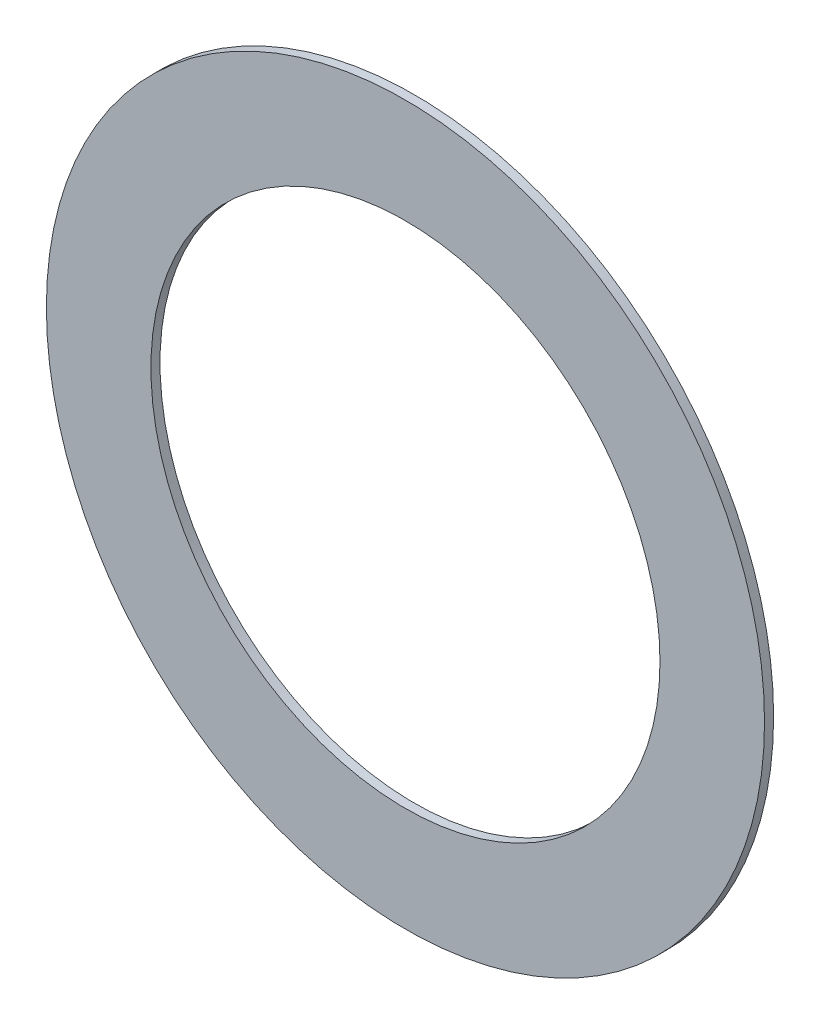
ISO-10303-21;
HEADER;
FILE_DESCRIPTION(('STEP AP214'),'2;1');
FILE_NAME('part.step','',(''),(''),'','','');
FILE_SCHEMA(('AUTOMOTIVE_DESIGN { 1 0 10303 214 1 1 1 1 }'));
ENDSEC;
DATA;
#1=APPLICATION_CONTEXT('core data for automotive mechanical design processes');
#2=APPLICATION_PROTOCOL_DEFINITION('international standard','automotive_design',2000,#1);
#3=PRODUCT_CONTEXT('',#1,'mechanical');
#4=PRODUCT('Part','Part','',(#3));
#5=PRODUCT_RELATED_PRODUCT_CATEGORY('part','',(#4));
#6=PRODUCT_DEFINITION_FORMATION('','',#4);
#7=PRODUCT_DEFINITION_CONTEXT('part definition',#1,'design');
#8=PRODUCT_DEFINITION('design','',#6,#7);
#9=PRODUCT_DEFINITION_SHAPE('','',#8);
#10=(LENGTH_UNIT() NAMED_UNIT(*) SI_UNIT(.MILLI.,.METRE.));
#11=(NAMED_UNIT(*) PLANE_ANGLE_UNIT() SI_UNIT($,.RADIAN.));
#12=(NAMED_UNIT(*) SI_UNIT($,.STERADIAN.) SOLID_ANGLE_UNIT());
#13=UNCERTAINTY_MEASURE_WITH_UNIT(LENGTH_MEASURE(1.E-05),#10,'distance_accuracy_value','');
#14=(GEOMETRIC_REPRESENTATION_CONTEXT(3) GLOBAL_UNCERTAINTY_ASSIGNED_CONTEXT((#13)) GLOBAL_UNIT_ASSIGNED_CONTEXT((#10,
#11,#12)) REPRESENTATION_CONTEXT('',''));
#15=CARTESIAN_POINT('',(0.,0.,0.));
#16=DIRECTION('',(0.,0.,1.));
#17=DIRECTION('',(1.,0.,0.));
#18=AXIS2_PLACEMENT_3D('',#15,#16,#17);
#19=CARTESIAN_POINT('',(0.,0.,0.5));
#20=DIRECTION('',(0.,0.,1.));
#21=DIRECTION('',(1.,0.,0.));
#22=AXIS2_PLACEMENT_3D('',#19,#20,#21);
#23=PLANE('',#22);
#24=CARTESIAN_POINT('',(0.,0.,0.5));
#25=DIRECTION('',(0.,0.,1.));
#26=DIRECTION('',(1.,0.,0.));
#27=AXIS2_PLACEMENT_3D('',#24,#25,#26);
#28=CIRCLE('',#27,19.75);
#29=CARTESIAN_POINT('',(19.75,0.,0.5));
#30=VERTEX_POINT('',#29);
#31=EDGE_CURVE('E10',#30,#30,#28,.T.);
#32=ORIENTED_EDGE('',*,*,#31,.T.);
#33=EDGE_LOOP('',(#32));
#34=FACE_BOUND('',#33,.T.);
#35=CARTESIAN_POINT('',(0.,0.,0.5));
#36=DIRECTION('',(0.,0.,1.));
#37=DIRECTION('',(1.,0.,0.));
#38=AXIS2_PLACEMENT_3D('',#35,#36,#37);
#39=CIRCLE('',#38,14.);
#40=CARTESIAN_POINT('',(14.,0.,0.5));
#41=VERTEX_POINT('',#40);
#42=EDGE_CURVE('E42',#41,#41,#39,.T.);
#43=ORIENTED_EDGE('',*,*,#42,.F.);
#44=EDGE_LOOP('',(#43));
#45=FACE_BOUND('',#44,.T.);
#46=ADVANCED_FACE('F31',(#34,#45),#23,.T.);
#47=CARTESIAN_POINT('',(0.,0.,0.));
#48=DIRECTION('',(0.,0.,1.));
#49=DIRECTION('',(1.,0.,0.));
#50=AXIS2_PLACEMENT_3D('',#47,#48,#49);
#51=PLANE('',#50);
#52=CARTESIAN_POINT('',(0.,0.,0.));
#53=DIRECTION('',(0.,0.,1.));
#54=DIRECTION('',(1.,0.,0.));
#55=AXIS2_PLACEMENT_3D('',#52,#53,#54);
#56=CIRCLE('',#55,19.75);
#57=CARTESIAN_POINT('',(19.75,0.,0.));
#58=VERTEX_POINT('',#57);
#59=EDGE_CURVE('E35',#58,#58,#56,.T.);
#60=ORIENTED_EDGE('',*,*,#59,.F.);
#61=EDGE_LOOP('',(#60));
#62=FACE_BOUND('',#61,.T.);
#63=CARTESIAN_POINT('',(0.,0.,0.));
#64=DIRECTION('',(0.,0.,1.));
#65=DIRECTION('',(1.,0.,0.));
#66=AXIS2_PLACEMENT_3D('',#63,#64,#65);
#67=CIRCLE('',#66,14.);
#68=CARTESIAN_POINT('',(14.,0.,0.));
#69=VERTEX_POINT('',#68);
#70=EDGE_CURVE('E44',#69,#69,#67,.T.);
#71=ORIENTED_EDGE('',*,*,#70,.T.);
#72=EDGE_LOOP('',(#71));
#73=FACE_BOUND('',#72,.T.);
#74=ADVANCED_FACE('F54',(#62,#73),#51,.F.);
#75=CARTESIAN_POINT('',(0.,0.,0.5));
#76=DIRECTION('',(0.,0.,-1.));
#77=DIRECTION('',(-1.,0.,0.));
#78=AXIS2_PLACEMENT_3D('',#75,#76,#77);
#79=CYLINDRICAL_SURFACE('',#78,19.75);
#80=ORIENTED_EDGE('',*,*,#31,.F.);
#81=EDGE_LOOP('',(#80));
#82=FACE_BOUND('',#81,.T.);
#83=ORIENTED_EDGE('',*,*,#59,.T.);
#84=EDGE_LOOP('',(#83));
#85=FACE_BOUND('',#84,.T.);
#86=ADVANCED_FACE('F33',(#82,#85),#79,.T.);
#87=CARTESIAN_POINT('',(0.,0.,0.5));
#88=DIRECTION('',(0.,0.,-1.));
#89=DIRECTION('',(-1.,0.,0.));
#90=AXIS2_PLACEMENT_3D('',#87,#88,#89);
#91=CYLINDRICAL_SURFACE('',#90,14.);
#92=ORIENTED_EDGE('',*,*,#42,.T.);
#93=EDGE_LOOP('',(#92));
#94=FACE_BOUND('',#93,.T.);
#95=ORIENTED_EDGE('',*,*,#70,.F.);
#96=EDGE_LOOP('',(#95));
#97=FACE_BOUND('',#96,.T.);
#98=ADVANCED_FACE('F50',(#94,#97),#91,.F.);
#99=CLOSED_SHELL('',(#46,#74,#86,#98));
#100=MANIFOLD_SOLID_BREP('B2',#99);
#101=ADVANCED_BREP_SHAPE_REPRESENTATION('',(#18,#100),#14);
#102=SHAPE_DEFINITION_REPRESENTATION(#9,#101);
ENDSEC;
END-ISO-10303-21;
